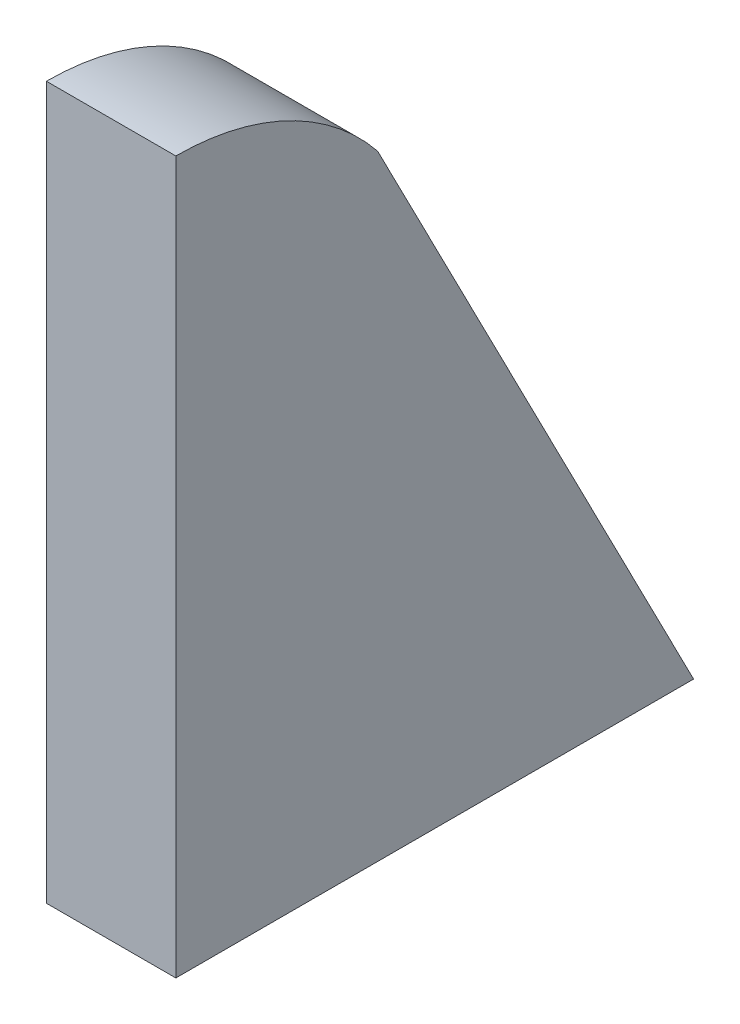
ISO-10303-21;
HEADER;
FILE_DESCRIPTION(('STEP AP214'),'2;1');
FILE_NAME('part.step','',(''),(''),'','','');
FILE_SCHEMA(('AUTOMOTIVE_DESIGN { 1 0 10303 214 1 1 1 1 }'));
ENDSEC;
DATA;
#1=APPLICATION_CONTEXT('core data for automotive mechanical design processes');
#2=APPLICATION_PROTOCOL_DEFINITION('international standard','automotive_design',2000,#1);
#3=PRODUCT_CONTEXT('',#1,'mechanical');
#4=PRODUCT('Part','Part','',(#3));
#5=PRODUCT_RELATED_PRODUCT_CATEGORY('part','',(#4));
#6=PRODUCT_DEFINITION_FORMATION('','',#4);
#7=PRODUCT_DEFINITION_CONTEXT('part definition',#1,'design');
#8=PRODUCT_DEFINITION('design','',#6,#7);
#9=PRODUCT_DEFINITION_SHAPE('','',#8);
#10=(LENGTH_UNIT() NAMED_UNIT(*) SI_UNIT(.MILLI.,.METRE.));
#11=(NAMED_UNIT(*) PLANE_ANGLE_UNIT() SI_UNIT($,.RADIAN.));
#12=(NAMED_UNIT(*) SI_UNIT($,.STERADIAN.) SOLID_ANGLE_UNIT());
#13=UNCERTAINTY_MEASURE_WITH_UNIT(LENGTH_MEASURE(1.E-05),#10,'distance_accuracy_value','');
#14=(GEOMETRIC_REPRESENTATION_CONTEXT(3) GLOBAL_UNCERTAINTY_ASSIGNED_CONTEXT((#13)) GLOBAL_UNIT_ASSIGNED_CONTEXT((#10,
#11,#12)) REPRESENTATION_CONTEXT('',''));
#15=CARTESIAN_POINT('',(0.,0.,0.));
#16=DIRECTION('',(0.,0.,1.));
#17=DIRECTION('',(1.,0.,0.));
#18=AXIS2_PLACEMENT_3D('',#15,#16,#17);
#19=CARTESIAN_POINT('',(10.,0.,0.));
#20=DIRECTION('',(0.,0.,-1.));
#21=DIRECTION('',(-1.,0.,0.));
#22=AXIS2_PLACEMENT_3D('',#19,#20,#21);
#23=PLANE('',#22);
#24=DIRECTION('',(0.,-1.,0.));
#25=VECTOR('',#24,1.);
#26=CARTESIAN_POINT('',(0.,0.,0.));
#27=LINE('',#26,#25);
#28=CARTESIAN_POINT('',(0.,55.,0.));
#29=VERTEX_POINT('',#28);
#30=CARTESIAN_POINT('',(0.,0.,0.));
#31=VERTEX_POINT('',#30);
#32=EDGE_CURVE('E111',#29,#31,#27,.T.);
#33=ORIENTED_EDGE('',*,*,#32,.T.);
#34=DIRECTION('',(-1.,0.,0.));
#35=VECTOR('',#34,1.);
#36=CARTESIAN_POINT('',(10.,0.,0.));
#37=LINE('',#36,#35);
#38=CARTESIAN_POINT('',(10.,0.,0.));
#39=VERTEX_POINT('',#38);
#40=EDGE_CURVE('E11',#39,#31,#37,.T.);
#41=ORIENTED_EDGE('',*,*,#40,.F.);
#42=DIRECTION('',(0.,-1.,0.));
#43=VECTOR('',#42,1.);
#44=CARTESIAN_POINT('',(10.,0.,0.));
#45=LINE('',#44,#43);
#46=CARTESIAN_POINT('',(10.,55.,0.));
#47=VERTEX_POINT('',#46);
#48=EDGE_CURVE('E100',#47,#39,#45,.T.);
#49=ORIENTED_EDGE('',*,*,#48,.F.);
#50=DIRECTION('',(-1.,0.,0.));
#51=VECTOR('',#50,1.);
#52=CARTESIAN_POINT('',(10.,55.,0.));
#53=LINE('',#52,#51);
#54=EDGE_CURVE('E108',#47,#29,#53,.T.);
#55=ORIENTED_EDGE('',*,*,#54,.T.);
#56=EDGE_LOOP('',(#33,#41,#49,#55));
#57=FACE_BOUND('',#56,.T.);
#58=ADVANCED_FACE('F44',(#57),#23,.F.);
#59=CARTESIAN_POINT('',(10.,0.,0.));
#60=DIRECTION('',(0.,1.,0.));
#61=DIRECTION('',(0.,0.,1.));
#62=AXIS2_PLACEMENT_3D('',#59,#60,#61);
#63=PLANE('',#62);
#64=DIRECTION('',(0.,0.,-1.));
#65=VECTOR('',#64,1.);
#66=CARTESIAN_POINT('',(0.,0.,0.));
#67=LINE('',#66,#65);
#68=CARTESIAN_POINT('',(0.,0.,-40.));
#69=VERTEX_POINT('',#68);
#70=EDGE_CURVE('E105',#31,#69,#67,.T.);
#71=ORIENTED_EDGE('',*,*,#70,.T.);
#72=DIRECTION('',(-1.,0.,0.));
#73=VECTOR('',#72,1.);
#74=CARTESIAN_POINT('',(10.,0.,-40.));
#75=LINE('',#74,#73);
#76=CARTESIAN_POINT('',(10.,0.,-40.));
#77=VERTEX_POINT('',#76);
#78=EDGE_CURVE('E53',#77,#69,#75,.T.);
#79=ORIENTED_EDGE('',*,*,#78,.F.);
#80=DIRECTION('',(0.,0.,-1.));
#81=VECTOR('',#80,1.);
#82=CARTESIAN_POINT('',(10.,0.,0.));
#83=LINE('',#82,#81);
#84=EDGE_CURVE('E95',#39,#77,#83,.T.);
#85=ORIENTED_EDGE('',*,*,#84,.F.);
#86=ORIENTED_EDGE('',*,*,#40,.T.);
#87=EDGE_LOOP('',(#71,#79,#85,#86));
#88=FACE_BOUND('',#87,.T.);
#89=ADVANCED_FACE('F102',(#88),#63,.F.);
#90=CARTESIAN_POINT('',(10.,0.,-40.));
#91=DIRECTION('',(0.,-0.4568846302181,0.889525960650093));
#92=DIRECTION('',(0.,-0.889525960650093,-0.4568846302181));
#93=AXIS2_PLACEMENT_3D('',#90,#91,#92);
#94=PLANE('',#93);
#95=DIRECTION('',(0.,0.889525960650093,0.4568846302181));
#96=VECTOR('',#95,1.);
#97=CARTESIAN_POINT('',(0.,0.,-40.));
#98=LINE('',#97,#96);
#99=CARTESIAN_POINT('',(0.,47.5338706880732,-15.58531634503));
#100=VERTEX_POINT('',#99);
#101=EDGE_CURVE('E80',#69,#100,#98,.T.);
#102=ORIENTED_EDGE('',*,*,#101,.T.);
#103=DIRECTION('',(-1.,0.,0.));
#104=VECTOR('',#103,1.);
#105=CARTESIAN_POINT('',(10.,47.5338706880732,-15.58531634503));
#106=LINE('',#105,#104);
#107=CARTESIAN_POINT('',(10.,47.5338706880732,-15.58531634503));
#108=VERTEX_POINT('',#107);
#109=EDGE_CURVE('E101',#108,#100,#106,.T.);
#110=ORIENTED_EDGE('',*,*,#109,.F.);
#111=DIRECTION('',(0.,0.889525960650093,0.4568846302181));
#112=VECTOR('',#111,1.);
#113=CARTESIAN_POINT('',(10.,0.,-40.));
#114=LINE('',#113,#112);
#115=EDGE_CURVE('E94',#77,#108,#114,.T.);
#116=ORIENTED_EDGE('',*,*,#115,.F.);
#117=ORIENTED_EDGE('',*,*,#78,.T.);
#118=EDGE_LOOP('',(#102,#110,#116,#117));
#119=FACE_BOUND('',#118,.T.);
#120=ADVANCED_FACE('F103',(#119),#94,.F.);
#121=CARTESIAN_POINT('',(10.,35.,0.));
#122=DIRECTION('',(-1.,0.,0.));
#123=DIRECTION('',(0.,0.,1.));
#124=AXIS2_PLACEMENT_3D('',#121,#122,#123);
#125=CYLINDRICAL_SURFACE('',#124,20.);
#126=CARTESIAN_POINT('',(0.,35.,0.));
#127=DIRECTION('',(1.,0.,0.));
#128=DIRECTION('',(0.,0.,1.));
#129=AXIS2_PLACEMENT_3D('',#126,#127,#128);
#130=CIRCLE('',#129,20.);
#131=EDGE_CURVE('E82',#100,#29,#130,.T.);
#132=ORIENTED_EDGE('',*,*,#131,.T.);
#133=ORIENTED_EDGE('',*,*,#54,.F.);
#134=CARTESIAN_POINT('',(10.,35.,0.));
#135=DIRECTION('',(1.,0.,0.));
#136=DIRECTION('',(0.,0.,1.));
#137=AXIS2_PLACEMENT_3D('',#134,#135,#136);
#138=CIRCLE('',#137,20.);
#139=EDGE_CURVE('E62',#108,#47,#138,.T.);
#140=ORIENTED_EDGE('',*,*,#139,.F.);
#141=ORIENTED_EDGE('',*,*,#109,.T.);
#142=EDGE_LOOP('',(#132,#133,#140,#141));
#143=FACE_BOUND('',#142,.T.);
#144=ADVANCED_FACE('F128',(#143),#125,.T.);
#145=CARTESIAN_POINT('',(10.,35.,0.));
#146=DIRECTION('',(-1.,0.,0.));
#147=DIRECTION('',(0.,0.,1.));
#148=AXIS2_PLACEMENT_3D('',#145,#146,#147);
#149=PLANE('',#148);
#150=ORIENTED_EDGE('',*,*,#48,.T.);
#151=ORIENTED_EDGE('',*,*,#84,.T.);
#152=ORIENTED_EDGE('',*,*,#115,.T.);
#153=ORIENTED_EDGE('',*,*,#139,.T.);
#154=EDGE_LOOP('',(#150,#151,#152,#153));
#155=FACE_BOUND('',#154,.T.);
#156=ADVANCED_FACE('F93',(#155),#149,.F.);
#157=CARTESIAN_POINT('',(0.,35.,0.));
#158=DIRECTION('',(-1.,0.,0.));
#159=DIRECTION('',(0.,0.,1.));
#160=AXIS2_PLACEMENT_3D('',#157,#158,#159);
#161=PLANE('',#160);
#162=ORIENTED_EDGE('',*,*,#32,.F.);
#163=ORIENTED_EDGE('',*,*,#131,.F.);
#164=ORIENTED_EDGE('',*,*,#101,.F.);
#165=ORIENTED_EDGE('',*,*,#70,.F.);
#166=EDGE_LOOP('',(#162,#163,#164,#165));
#167=FACE_BOUND('',#166,.T.);
#168=ADVANCED_FACE('F129',(#167),#161,.T.);
#169=CLOSED_SHELL('',(#58,#89,#120,#144,#156,#168));
#170=MANIFOLD_SOLID_BREP('B2',#169);
#171=ADVANCED_BREP_SHAPE_REPRESENTATION('',(#18,#170),#14);
#172=SHAPE_DEFINITION_REPRESENTATION(#9,#171);
ENDSEC;
END-ISO-10303-21;
